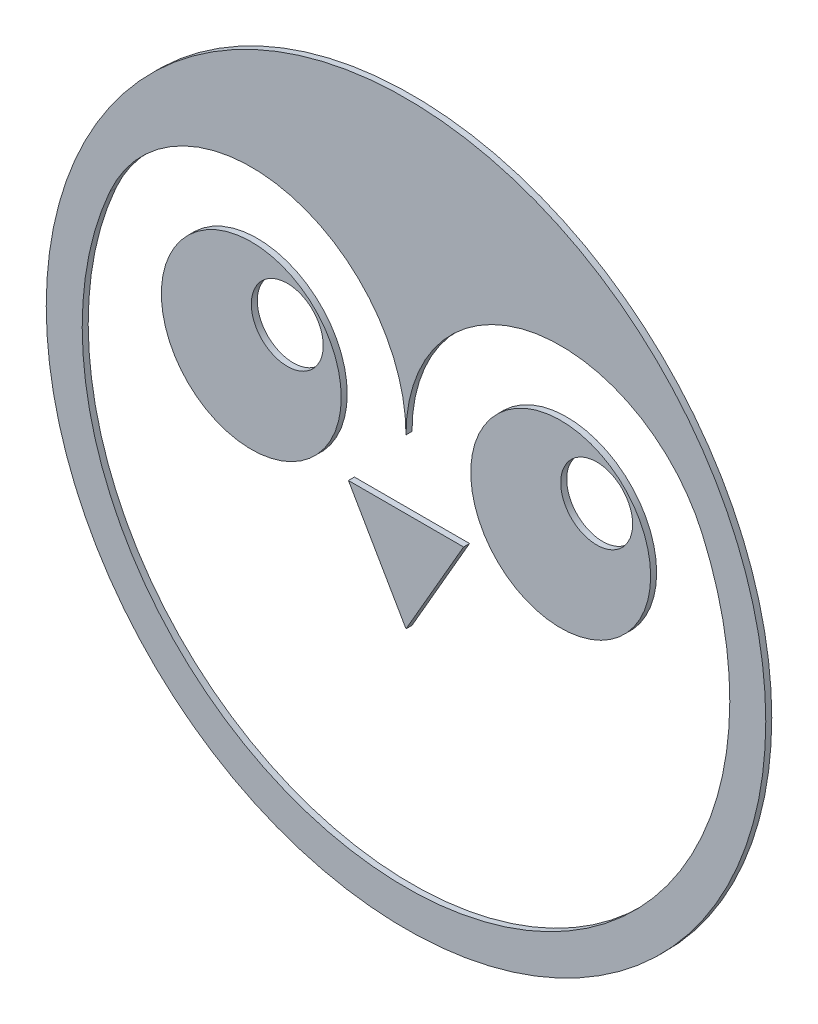
ISO-10303-21;
HEADER;
FILE_DESCRIPTION(('STEP AP214'),'2;1');
FILE_NAME('part.step','',(''),(''),'','','');
FILE_SCHEMA(('AUTOMOTIVE_DESIGN { 1 0 10303 214 1 1 1 1 }'));
ENDSEC;
DATA;
#1=APPLICATION_CONTEXT('core data for automotive mechanical design processes');
#2=APPLICATION_PROTOCOL_DEFINITION('international standard','automotive_design',2000,#1);
#3=PRODUCT_CONTEXT('',#1,'mechanical');
#4=PRODUCT('Part','Part','',(#3));
#5=PRODUCT_RELATED_PRODUCT_CATEGORY('part','',(#4));
#6=PRODUCT_DEFINITION_FORMATION('','',#4);
#7=PRODUCT_DEFINITION_CONTEXT('part definition',#1,'design');
#8=PRODUCT_DEFINITION('design','',#6,#7);
#9=PRODUCT_DEFINITION_SHAPE('','',#8);
#10=(LENGTH_UNIT() NAMED_UNIT(*) SI_UNIT(.MILLI.,.METRE.));
#11=(NAMED_UNIT(*) PLANE_ANGLE_UNIT() SI_UNIT($,.RADIAN.));
#12=(NAMED_UNIT(*) SI_UNIT($,.STERADIAN.) SOLID_ANGLE_UNIT());
#13=UNCERTAINTY_MEASURE_WITH_UNIT(LENGTH_MEASURE(1.E-05),#10,'distance_accuracy_value','');
#14=(GEOMETRIC_REPRESENTATION_CONTEXT(3) GLOBAL_UNCERTAINTY_ASSIGNED_CONTEXT((#13)) GLOBAL_UNIT_ASSIGNED_CONTEXT((#10,
#11,#12)) REPRESENTATION_CONTEXT('',''));
#15=CARTESIAN_POINT('',(0.,0.,0.));
#16=DIRECTION('',(0.,0.,1.));
#17=DIRECTION('',(1.,0.,0.));
#18=AXIS2_PLACEMENT_3D('',#15,#16,#17);
#19=CARTESIAN_POINT('',(0.,0.,-10.));
#20=DIRECTION('',(0.,0.,1.));
#21=DIRECTION('',(1.,0.,0.));
#22=AXIS2_PLACEMENT_3D('',#19,#20,#21);
#23=PLANE('',#22);
#24=DIRECTION('',(-0.5,0.866025403784439,0.));
#25=VECTOR('',#24,1.);
#26=CARTESIAN_POINT('',(-84.,-20.7846096908265,-10.));
#27=LINE('',#26,#25);
#28=CARTESIAN_POINT('',(0.,-166.276877526612,-10.));
#29=VERTEX_POINT('',#28);
#30=CARTESIAN_POINT('',(-96.,0.,-10.));
#31=VERTEX_POINT('',#30);
#32=EDGE_CURVE('P0_E21',#29,#31,#27,.T.);
#33=ORIENTED_EDGE('',*,*,#32,.T.);
#34=DIRECTION('',(1.,0.,0.));
#35=VECTOR('',#34,1.);
#36=CARTESIAN_POINT('',(48.,0.,-10.));
#37=LINE('',#36,#35);
#38=CARTESIAN_POINT('',(96.,0.,-10.));
#39=VERTEX_POINT('',#38);
#40=EDGE_CURVE('P0_E28',#31,#39,#37,.T.);
#41=ORIENTED_EDGE('',*,*,#40,.T.);
#42=DIRECTION('',(-0.5,-0.866025403784439,0.));
#43=VECTOR('',#42,1.);
#44=CARTESIAN_POINT('',(36.,-103.923048454133,-10.));
#45=LINE('',#44,#43);
#46=EDGE_CURVE('P0_E60',#39,#29,#45,.T.);
#47=ORIENTED_EDGE('',*,*,#46,.T.);
#48=EDGE_LOOP('',(#33,#41,#47));
#49=FACE_BOUND('',#48,.T.);
#50=ADVANCED_FACE('P0_F17',(#49),#23,.F.);
#51=CARTESIAN_POINT('',(0.,0.,0.));
#52=DIRECTION('',(0.,0.,1.));
#53=DIRECTION('',(1.,0.,0.));
#54=AXIS2_PLACEMENT_3D('',#51,#52,#53);
#55=PLANE('',#54);
#56=DIRECTION('',(0.5,-0.866025403784439,0.));
#57=VECTOR('',#56,1.);
#58=CARTESIAN_POINT('',(-84.,-20.7846096908265,0.));
#59=LINE('',#58,#57);
#60=CARTESIAN_POINT('',(-96.,0.,0.));
#61=VERTEX_POINT('',#60);
#62=CARTESIAN_POINT('',(0.,-166.276877526612,0.));
#63=VERTEX_POINT('',#62);
#64=EDGE_CURVE('P0_E89',#61,#63,#59,.T.);
#65=ORIENTED_EDGE('',*,*,#64,.T.);
#66=DIRECTION('',(0.5,0.866025403784439,0.));
#67=VECTOR('',#66,1.);
#68=CARTESIAN_POINT('',(36.,-103.923048454133,0.));
#69=LINE('',#68,#67);
#70=CARTESIAN_POINT('',(96.,0.,0.));
#71=VERTEX_POINT('',#70);
#72=EDGE_CURVE('P0_E71',#63,#71,#69,.T.);
#73=ORIENTED_EDGE('',*,*,#72,.T.);
#74=DIRECTION('',(-1.,0.,0.));
#75=VECTOR('',#74,1.);
#76=CARTESIAN_POINT('',(48.,0.,0.));
#77=LINE('',#76,#75);
#78=EDGE_CURVE('P0_E11',#71,#61,#77,.T.);
#79=ORIENTED_EDGE('',*,*,#78,.T.);
#80=EDGE_LOOP('',(#65,#73,#79));
#81=FACE_BOUND('',#80,.T.);
#82=ADVANCED_FACE('P0_F102',(#81),#55,.T.);
#83=CARTESIAN_POINT('',(96.,0.,0.));
#84=DIRECTION('',(0.,-1.,0.));
#85=DIRECTION('',(0.,0.,-1.));
#86=AXIS2_PLACEMENT_3D('',#83,#84,#85);
#87=PLANE('',#86);
#88=ORIENTED_EDGE('',*,*,#40,.F.);
#89=DIRECTION('',(0.,0.,-1.));
#90=VECTOR('',#89,1.);
#91=CARTESIAN_POINT('',(-96.,0.,0.));
#92=LINE('',#91,#90);
#93=EDGE_CURVE('P0_E64',#61,#31,#92,.T.);
#94=ORIENTED_EDGE('',*,*,#93,.F.);
#95=ORIENTED_EDGE('',*,*,#78,.F.);
#96=DIRECTION('',(0.,0.,-1.));
#97=VECTOR('',#96,1.);
#98=CARTESIAN_POINT('',(96.,0.,0.));
#99=LINE('',#98,#97);
#100=EDGE_CURVE('P0_E67',#71,#39,#99,.T.);
#101=ORIENTED_EDGE('',*,*,#100,.T.);
#102=EDGE_LOOP('',(#88,#94,#95,#101));
#103=FACE_BOUND('',#102,.T.);
#104=ADVANCED_FACE('P0_F19',(#103),#87,.F.);
#105=CARTESIAN_POINT('',(-96.,0.,0.));
#106=DIRECTION('',(0.866025403784439,0.5,0.));
#107=DIRECTION('',(0.,0.,-1.));
#108=AXIS2_PLACEMENT_3D('',#105,#106,#107);
#109=PLANE('',#108);
#110=ORIENTED_EDGE('',*,*,#32,.F.);
#111=DIRECTION('',(0.,0.,-1.));
#112=VECTOR('',#111,1.);
#113=CARTESIAN_POINT('',(0.,-166.276877526612,0.));
#114=LINE('',#113,#112);
#115=EDGE_CURVE('P0_E76',#63,#29,#114,.T.);
#116=ORIENTED_EDGE('',*,*,#115,.F.);
#117=ORIENTED_EDGE('',*,*,#64,.F.);
#118=ORIENTED_EDGE('',*,*,#93,.T.);
#119=EDGE_LOOP('',(#110,#116,#117,#118));
#120=FACE_BOUND('',#119,.T.);
#121=ADVANCED_FACE('P0_F103',(#120),#109,.F.);
#122=CARTESIAN_POINT('',(0.,-166.276877526612,0.));
#123=DIRECTION('',(-0.866025403784439,0.5,0.));
#124=DIRECTION('',(0.,0.,1.));
#125=AXIS2_PLACEMENT_3D('',#122,#123,#124);
#126=PLANE('',#125);
#127=ORIENTED_EDGE('',*,*,#46,.F.);
#128=ORIENTED_EDGE('',*,*,#100,.F.);
#129=ORIENTED_EDGE('',*,*,#72,.F.);
#130=ORIENTED_EDGE('',*,*,#115,.T.);
#131=EDGE_LOOP('',(#127,#128,#129,#130));
#132=FACE_BOUND('',#131,.T.);
#133=ADVANCED_FACE('P0_F74',(#132),#126,.F.);
#134=CLOSED_SHELL('',(#50,#82,#104,#121,#133));
#135=MANIFOLD_SOLID_BREP('P0_B1',#134);
#136=CARTESIAN_POINT('',(258.,113.841995766061,0.));
#137=DIRECTION('',(0.,0.,-1.));
#138=DIRECTION('',(-1.,0.,0.));
#139=AXIS2_PLACEMENT_3D('',#136,#137,#138);
#140=CYLINDRICAL_SURFACE('',#139,150.);
#141=CARTESIAN_POINT('',(258.,113.841995766061,0.));
#142=DIRECTION('',(0.,0.,1.));
#143=DIRECTION('',(-1.,0.,0.));
#144=AXIS2_PLACEMENT_3D('',#141,#142,#143);
#145=CIRCLE('',#144,150.);
#146=CARTESIAN_POINT('',(408.,113.841995766061,0.));
#147=VERTEX_POINT('',#146);
#148=EDGE_CURVE('P1_E53',#147,#147,#145,.T.);
#149=ORIENTED_EDGE('',*,*,#148,.F.);
#150=DIRECTION('',(0.,0.,-1.));
#151=VECTOR('',#150,1.);
#152=CARTESIAN_POINT('',(408.,113.841995766061,0.));
#153=LINE('',#152,#151);
#154=CARTESIAN_POINT('',(408.,113.841995766061,-10.));
#155=VERTEX_POINT('',#154);
#156=EDGE_CURVE('P1_E11',#147,#155,#153,.T.);
#157=ORIENTED_EDGE('',*,*,#156,.T.);
#158=CARTESIAN_POINT('',(258.,113.841995766061,-10.));
#159=DIRECTION('',(0.,0.,-1.));
#160=DIRECTION('',(-1.,0.,0.));
#161=AXIS2_PLACEMENT_3D('',#158,#159,#160);
#162=CIRCLE('',#161,150.);
#163=EDGE_CURVE('P1_E52',#155,#155,#162,.T.);
#164=ORIENTED_EDGE('',*,*,#163,.F.);
#165=ORIENTED_EDGE('',*,*,#156,.F.);
#166=EDGE_LOOP('',(#149,#157,#164,#165));
#167=FACE_BOUND('',#166,.T.);
#168=ADVANCED_FACE('P1_F17',(#167),#140,.T.);
#169=CARTESIAN_POINT('',(318.,173.841995766062,0.));
#170=DIRECTION('',(0.,0.,-1.));
#171=DIRECTION('',(-1.,0.,0.));
#172=AXIS2_PLACEMENT_3D('',#169,#170,#171);
#173=CYLINDRICAL_SURFACE('',#172,60.);
#174=CARTESIAN_POINT('',(318.,173.841995766062,0.));
#175=DIRECTION('',(0.,0.,-1.));
#176=DIRECTION('',(-1.,0.,0.));
#177=AXIS2_PLACEMENT_3D('',#174,#175,#176);
#178=CIRCLE('',#177,60.);
#179=CARTESIAN_POINT('',(378.,173.841995766062,0.));
#180=VERTEX_POINT('',#179);
#181=EDGE_CURVE('P1_E67',#180,#180,#178,.T.);
#182=ORIENTED_EDGE('',*,*,#181,.F.);
#183=DIRECTION('',(0.,0.,-1.));
#184=VECTOR('',#183,1.);
#185=CARTESIAN_POINT('',(378.,173.841995766062,0.));
#186=LINE('',#185,#184);
#187=CARTESIAN_POINT('',(378.,173.841995766062,-10.));
#188=VERTEX_POINT('',#187);
#189=EDGE_CURVE('P1_E25',#180,#188,#186,.T.);
#190=ORIENTED_EDGE('',*,*,#189,.T.);
#191=CARTESIAN_POINT('',(318.,173.841995766062,-10.));
#192=DIRECTION('',(0.,0.,1.));
#193=DIRECTION('',(-1.,0.,0.));
#194=AXIS2_PLACEMENT_3D('',#191,#192,#193);
#195=CIRCLE('',#194,60.);
#196=EDGE_CURVE('P1_E57',#188,#188,#195,.T.);
#197=ORIENTED_EDGE('',*,*,#196,.F.);
#198=ORIENTED_EDGE('',*,*,#189,.F.);
#199=EDGE_LOOP('',(#182,#190,#197,#198));
#200=FACE_BOUND('',#199,.T.);
#201=ADVANCED_FACE('P1_F76',(#200),#173,.F.);
#202=CARTESIAN_POINT('',(0.,0.,0.));
#203=DIRECTION('',(0.,0.,1.));
#204=DIRECTION('',(1.,0.,0.));
#205=AXIS2_PLACEMENT_3D('',#202,#203,#204);
#206=PLANE('',#205);
#207=ORIENTED_EDGE('',*,*,#181,.T.);
#208=EDGE_LOOP('',(#207));
#209=FACE_BOUND('',#208,.T.);
#210=ORIENTED_EDGE('',*,*,#148,.T.);
#211=EDGE_LOOP('',(#210));
#212=FACE_BOUND('',#211,.T.);
#213=ADVANCED_FACE('P1_F74',(#209,#212),#206,.T.);
#214=CARTESIAN_POINT('',(0.,0.,-10.));
#215=DIRECTION('',(0.,0.,1.));
#216=DIRECTION('',(1.,0.,0.));
#217=AXIS2_PLACEMENT_3D('',#214,#215,#216);
#218=PLANE('',#217);
#219=ORIENTED_EDGE('',*,*,#196,.T.);
#220=EDGE_LOOP('',(#219));
#221=FACE_BOUND('',#220,.T.);
#222=ORIENTED_EDGE('',*,*,#163,.T.);
#223=EDGE_LOOP('',(#222));
#224=FACE_BOUND('',#223,.T.);
#225=ADVANCED_FACE('P1_F55',(#221,#224),#218,.F.);
#226=CLOSED_SHELL('',(#168,#201,#213,#225));
#227=MANIFOLD_SOLID_BREP('P1_B1',#226);
#228=CARTESIAN_POINT('',(0.,0.,-10.));
#229=DIRECTION('',(0.,0.,1.));
#230=DIRECTION('',(1.,0.,0.));
#231=AXIS2_PLACEMENT_3D('',#228,#229,#230);
#232=PLANE('',#231);
#233=CARTESIAN_POINT('',(-198.,173.841995766069,-10.));
#234=DIRECTION('',(0.,0.,1.));
#235=DIRECTION('',(-1.,0.,0.));
#236=AXIS2_PLACEMENT_3D('',#233,#234,#235);
#237=CIRCLE('',#236,60.);
#238=CARTESIAN_POINT('',(-138.,173.841995766069,-10.));
#239=VERTEX_POINT('',#238);
#240=EDGE_CURVE('P2_E11',#239,#239,#237,.T.);
#241=ORIENTED_EDGE('',*,*,#240,.T.);
#242=EDGE_LOOP('',(#241));
#243=FACE_BOUND('',#242,.T.);
#244=CARTESIAN_POINT('',(-258.,113.841995766062,-10.));
#245=DIRECTION('',(0.,0.,-1.));
#246=DIRECTION('',(-1.,0.,0.));
#247=AXIS2_PLACEMENT_3D('',#244,#245,#246);
#248=CIRCLE('',#247,150.);
#249=CARTESIAN_POINT('',(-108.,113.841995766062,-10.));
#250=VERTEX_POINT('',#249);
#251=EDGE_CURVE('P2_E59',#250,#250,#248,.T.);
#252=ORIENTED_EDGE('',*,*,#251,.T.);
#253=EDGE_LOOP('',(#252));
#254=FACE_BOUND('',#253,.T.);
#255=ADVANCED_FACE('P2_F17',(#243,#254),#232,.F.);
#256=CARTESIAN_POINT('',(0.,0.,0.));
#257=DIRECTION('',(0.,0.,1.));
#258=DIRECTION('',(1.,0.,0.));
#259=AXIS2_PLACEMENT_3D('',#256,#257,#258);
#260=PLANE('',#259);
#261=CARTESIAN_POINT('',(-198.,173.841995766069,0.));
#262=DIRECTION('',(0.,0.,-1.));
#263=DIRECTION('',(-1.,0.,0.));
#264=AXIS2_PLACEMENT_3D('',#261,#262,#263);
#265=CIRCLE('',#264,60.);
#266=CARTESIAN_POINT('',(-138.,173.841995766069,0.));
#267=VERTEX_POINT('',#266);
#268=EDGE_CURVE('P2_E70',#267,#267,#265,.T.);
#269=ORIENTED_EDGE('',*,*,#268,.T.);
#270=EDGE_LOOP('',(#269));
#271=FACE_BOUND('',#270,.T.);
#272=CARTESIAN_POINT('',(-258.,113.841995766062,0.));
#273=DIRECTION('',(0.,0.,1.));
#274=DIRECTION('',(-1.,0.,0.));
#275=AXIS2_PLACEMENT_3D('',#272,#273,#274);
#276=CIRCLE('',#275,150.);
#277=CARTESIAN_POINT('',(-108.,113.841995766062,0.));
#278=VERTEX_POINT('',#277);
#279=EDGE_CURVE('P2_E58',#278,#278,#276,.T.);
#280=ORIENTED_EDGE('',*,*,#279,.T.);
#281=EDGE_LOOP('',(#280));
#282=FACE_BOUND('',#281,.T.);
#283=ADVANCED_FACE('P2_F63',(#271,#282),#260,.T.);
#284=CARTESIAN_POINT('',(-198.,173.841995766069,0.));
#285=DIRECTION('',(0.,0.,-1.));
#286=DIRECTION('',(-1.,0.,0.));
#287=AXIS2_PLACEMENT_3D('',#284,#285,#286);
#288=CYLINDRICAL_SURFACE('',#287,60.);
#289=ORIENTED_EDGE('',*,*,#268,.F.);
#290=DIRECTION('',(0.,0.,-1.));
#291=VECTOR('',#290,1.);
#292=CARTESIAN_POINT('',(-138.,173.841995766069,0.));
#293=LINE('',#292,#291);
#294=EDGE_CURVE('P2_E21',#267,#239,#293,.T.);
#295=ORIENTED_EDGE('',*,*,#294,.T.);
#296=ORIENTED_EDGE('',*,*,#240,.F.);
#297=ORIENTED_EDGE('',*,*,#294,.F.);
#298=EDGE_LOOP('',(#289,#295,#296,#297));
#299=FACE_BOUND('',#298,.T.);
#300=ADVANCED_FACE('P2_F19',(#299),#288,.F.);
#301=CARTESIAN_POINT('',(-258.,113.841995766062,0.));
#302=DIRECTION('',(0.,0.,-1.));
#303=DIRECTION('',(-1.,0.,0.));
#304=AXIS2_PLACEMENT_3D('',#301,#302,#303);
#305=CYLINDRICAL_SURFACE('',#304,150.);
#306=ORIENTED_EDGE('',*,*,#279,.F.);
#307=DIRECTION('',(0.,0.,-1.));
#308=VECTOR('',#307,1.);
#309=CARTESIAN_POINT('',(-108.,113.841995766062,0.));
#310=LINE('',#309,#308);
#311=EDGE_CURVE('P2_E55',#278,#250,#310,.T.);
#312=ORIENTED_EDGE('',*,*,#311,.T.);
#313=ORIENTED_EDGE('',*,*,#251,.F.);
#314=ORIENTED_EDGE('',*,*,#311,.F.);
#315=EDGE_LOOP('',(#306,#312,#313,#314));
#316=FACE_BOUND('',#315,.T.);
#317=ADVANCED_FACE('P2_F57',(#316),#305,.T.);
#318=CLOSED_SHELL('',(#255,#283,#300,#317));
#319=MANIFOLD_SOLID_BREP('P2_B1',#318);
#320=CARTESIAN_POINT('',(258.,113.841995766061,0.));
#321=DIRECTION('',(0.,0.,-1.));
#322=DIRECTION('',(0.914893617021277,0.403695020447026,0.));
#323=AXIS2_PLACEMENT_3D('',#320,#321,#322);
#324=CYLINDRICAL_SURFACE('',#323,258.);
#325=CARTESIAN_POINT('',(258.,113.841995766061,-10.));
#326=DIRECTION('',(0.,0.,1.));
#327=DIRECTION('',(0.914893617021277,0.403695020447026,0.));
#328=AXIS2_PLACEMENT_3D('',#325,#326,#327);
#329=CIRCLE('',#328,258.);
#330=CARTESIAN_POINT('',(494.04255319149,217.995311041394,-10.));
#331=VERTEX_POINT('',#330);
#332=CARTESIAN_POINT('',(1.50990331349021E-13,113.841995766062,-10.));
#333=VERTEX_POINT('',#332);
#334=EDGE_CURVE('P3_E81',#331,#333,#329,.T.);
#335=ORIENTED_EDGE('',*,*,#334,.F.);
#336=DIRECTION('',(0.,0.,-1.));
#337=VECTOR('',#336,1.);
#338=CARTESIAN_POINT('',(494.04255319149,217.995311041394,0.));
#339=LINE('',#338,#337);
#340=CARTESIAN_POINT('',(494.04255319149,217.995311041394,0.));
#341=VERTEX_POINT('',#340);
#342=EDGE_CURVE('P3_E27',#341,#331,#339,.T.);
#343=ORIENTED_EDGE('',*,*,#342,.F.);
#344=CARTESIAN_POINT('',(258.,113.841995766061,0.));
#345=DIRECTION('',(0.,0.,-1.));
#346=DIRECTION('',(0.914893617021277,0.403695020447026,0.));
#347=AXIS2_PLACEMENT_3D('',#344,#345,#346);
#348=CIRCLE('',#347,258.);
#349=CARTESIAN_POINT('',(1.50990331349021E-13,113.841995766062,0.));
#350=VERTEX_POINT('',#349);
#351=EDGE_CURVE('P3_E78',#350,#341,#348,.T.);
#352=ORIENTED_EDGE('',*,*,#351,.F.);
#353=DIRECTION('',(0.,0.,-1.));
#354=VECTOR('',#353,1.);
#355=CARTESIAN_POINT('',(1.50990331349021E-13,113.841995766062,0.));
#356=LINE('',#355,#354);
#357=EDGE_CURVE('P3_E10',#350,#333,#356,.T.);
#358=ORIENTED_EDGE('',*,*,#357,.T.);
#359=EDGE_LOOP('',(#335,#343,#352,#358));
#360=FACE_BOUND('',#359,.T.);
#361=ADVANCED_FACE('P3_F16',(#360),#324,.F.);
#362=CARTESIAN_POINT('',(-258.,113.841995766062,0.));
#363=DIRECTION('',(0.,0.,-1.));
#364=DIRECTION('',(1.,0.,0.));
#365=AXIS2_PLACEMENT_3D('',#362,#363,#364);
#366=CYLINDRICAL_SURFACE('',#365,258.);
#367=CARTESIAN_POINT('',(-258.,113.841995766062,-10.));
#368=DIRECTION('',(0.,0.,1.));
#369=DIRECTION('',(1.,0.,0.));
#370=AXIS2_PLACEMENT_3D('',#367,#368,#369);
#371=CIRCLE('',#370,258.);
#372=CARTESIAN_POINT('',(-494.042553191489,217.995311041395,-10.));
#373=VERTEX_POINT('',#372);
#374=EDGE_CURVE('P3_E97',#333,#373,#371,.T.);
#375=ORIENTED_EDGE('',*,*,#374,.F.);
#376=ORIENTED_EDGE('',*,*,#357,.F.);
#377=CARTESIAN_POINT('',(-258.,113.841995766062,0.));
#378=DIRECTION('',(0.,0.,-1.));
#379=DIRECTION('',(1.,0.,0.));
#380=AXIS2_PLACEMENT_3D('',#377,#378,#379);
#381=CIRCLE('',#380,258.);
#382=CARTESIAN_POINT('',(-494.042553191489,217.995311041395,0.));
#383=VERTEX_POINT('',#382);
#384=EDGE_CURVE('P3_E77',#383,#350,#381,.T.);
#385=ORIENTED_EDGE('',*,*,#384,.F.);
#386=DIRECTION('',(0.,0.,-1.));
#387=VECTOR('',#386,1.);
#388=CARTESIAN_POINT('',(-494.042553191489,217.995311041395,0.));
#389=LINE('',#388,#387);
#390=EDGE_CURVE('P3_E61',#383,#373,#389,.T.);
#391=ORIENTED_EDGE('',*,*,#390,.T.);
#392=EDGE_LOOP('',(#375,#376,#385,#391));
#393=FACE_BOUND('',#392,.T.);
#394=ADVANCED_FACE('P3_F18',(#393),#366,.F.);
#395=CARTESIAN_POINT('',(0.,0.,0.));
#396=DIRECTION('',(0.,0.,-1.));
#397=DIRECTION('',(0.,-1.,0.));
#398=AXIS2_PLACEMENT_3D('',#395,#396,#397);
#399=CYLINDRICAL_SURFACE('',#398,540.);
#400=CARTESIAN_POINT('',(0.,0.,-10.));
#401=DIRECTION('',(0.,0.,1.));
#402=DIRECTION('',(-0.914893617021276,0.403695020447028,0.));
#403=AXIS2_PLACEMENT_3D('',#400,#401,#402);
#404=CIRCLE('',#403,540.);
#405=EDGE_CURVE('P3_E66',#373,#331,#404,.T.);
#406=ORIENTED_EDGE('',*,*,#405,.F.);
#407=ORIENTED_EDGE('',*,*,#390,.F.);
#408=CARTESIAN_POINT('',(0.,0.,0.));
#409=DIRECTION('',(0.,0.,-1.));
#410=DIRECTION('',(-0.914893617021276,0.403695020447028,0.));
#411=AXIS2_PLACEMENT_3D('',#408,#409,#410);
#412=CIRCLE('',#411,540.);
#413=EDGE_CURVE('P3_E20',#341,#383,#412,.T.);
#414=ORIENTED_EDGE('',*,*,#413,.F.);
#415=ORIENTED_EDGE('',*,*,#342,.T.);
#416=EDGE_LOOP('',(#406,#407,#414,#415));
#417=FACE_BOUND('',#416,.T.);
#418=ADVANCED_FACE('P3_F63',(#417),#399,.F.);
#419=CARTESIAN_POINT('',(0.,0.,0.));
#420=DIRECTION('',(0.,0.,1.));
#421=DIRECTION('',(1.,0.,0.));
#422=AXIS2_PLACEMENT_3D('',#419,#420,#421);
#423=PLANE('',#422);
#424=ORIENTED_EDGE('',*,*,#384,.T.);
#425=ORIENTED_EDGE('',*,*,#351,.T.);
#426=ORIENTED_EDGE('',*,*,#413,.T.);
#427=EDGE_LOOP('',(#424,#425,#426));
#428=FACE_BOUND('',#427,.T.);
#429=CARTESIAN_POINT('',(0.,0.,0.));
#430=DIRECTION('',(0.,0.,1.));
#431=DIRECTION('',(-1.,0.,0.));
#432=AXIS2_PLACEMENT_3D('',#429,#430,#431);
#433=CIRCLE('',#432,600.);
#434=CARTESIAN_POINT('',(600.,0.,0.));
#435=VERTEX_POINT('',#434);
#436=EDGE_CURVE('P3_E95',#435,#435,#433,.T.);
#437=ORIENTED_EDGE('',*,*,#436,.T.);
#438=EDGE_LOOP('',(#437));
#439=FACE_BOUND('',#438,.T.);
#440=ADVANCED_FACE('P3_F75',(#428,#439),#423,.T.);
#441=CARTESIAN_POINT('',(0.,0.,-10.));
#442=DIRECTION('',(0.,0.,1.));
#443=DIRECTION('',(1.,0.,0.));
#444=AXIS2_PLACEMENT_3D('',#441,#442,#443);
#445=PLANE('',#444);
#446=ORIENTED_EDGE('',*,*,#374,.T.);
#447=ORIENTED_EDGE('',*,*,#405,.T.);
#448=ORIENTED_EDGE('',*,*,#334,.T.);
#449=EDGE_LOOP('',(#446,#447,#448));
#450=FACE_BOUND('',#449,.T.);
#451=CARTESIAN_POINT('',(0.,0.,-10.));
#452=DIRECTION('',(0.,0.,-1.));
#453=DIRECTION('',(-1.,0.,0.));
#454=AXIS2_PLACEMENT_3D('',#451,#452,#453);
#455=CIRCLE('',#454,600.);
#456=CARTESIAN_POINT('',(600.,0.,-10.));
#457=VERTEX_POINT('',#456);
#458=EDGE_CURVE('P3_E96',#457,#457,#455,.T.);
#459=ORIENTED_EDGE('',*,*,#458,.T.);
#460=EDGE_LOOP('',(#459));
#461=FACE_BOUND('',#460,.T.);
#462=ADVANCED_FACE('P3_F109',(#450,#461),#445,.F.);
#463=CARTESIAN_POINT('',(0.,0.,0.));
#464=DIRECTION('',(0.,0.,-1.));
#465=DIRECTION('',(-1.,0.,0.));
#466=AXIS2_PLACEMENT_3D('',#463,#464,#465);
#467=CYLINDRICAL_SURFACE('',#466,600.);
#468=ORIENTED_EDGE('',*,*,#458,.F.);
#469=DIRECTION('',(0.,0.,1.));
#470=VECTOR('',#469,1.);
#471=CARTESIAN_POINT('',(600.,0.,0.));
#472=LINE('',#471,#470);
#473=EDGE_CURVE('P3_E91',#457,#435,#472,.T.);
#474=ORIENTED_EDGE('',*,*,#473,.T.);
#475=ORIENTED_EDGE('',*,*,#436,.F.);
#476=ORIENTED_EDGE('',*,*,#473,.F.);
#477=EDGE_LOOP('',(#468,#474,#475,#476));
#478=FACE_BOUND('',#477,.T.);
#479=ADVANCED_FACE('P3_F136',(#478),#467,.T.);
#480=CLOSED_SHELL('',(#361,#394,#418,#440,#462,#479));
#481=MANIFOLD_SOLID_BREP('P3_B1',#480);
#482=ADVANCED_BREP_SHAPE_REPRESENTATION('',(#18,#135,#227,#319,#481),#14);
#483=SHAPE_DEFINITION_REPRESENTATION(#9,#482);
ENDSEC;
END-ISO-10303-21;
